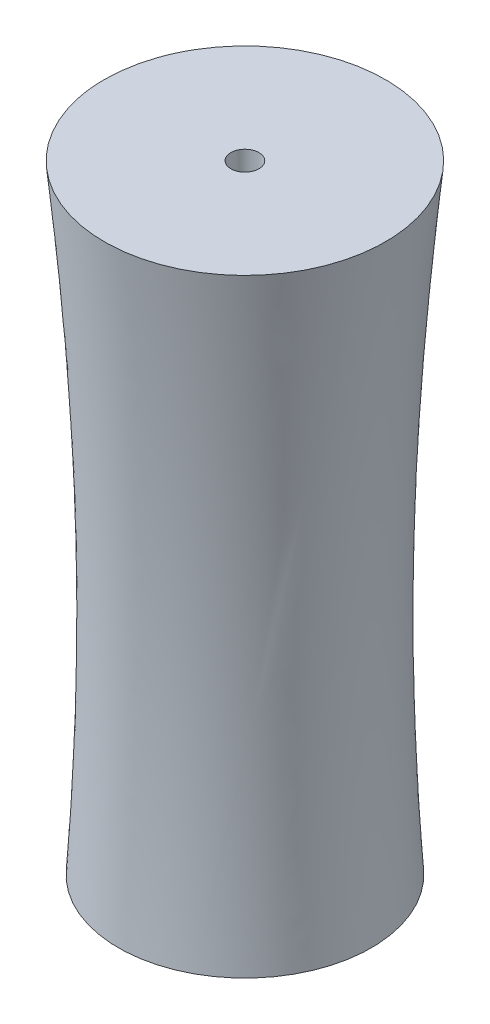
ISO-10303-21;
HEADER;
FILE_DESCRIPTION(('STEP AP214'),'2;1');
FILE_NAME('part.step','',(''),(''),'','','');
FILE_SCHEMA(('AUTOMOTIVE_DESIGN { 1 0 10303 214 1 1 1 1 }'));
ENDSEC;
DATA;
#1=APPLICATION_CONTEXT('core data for automotive mechanical design processes');
#2=APPLICATION_PROTOCOL_DEFINITION('international standard','automotive_design',2000,#1);
#3=PRODUCT_CONTEXT('',#1,'mechanical');
#4=PRODUCT('Part','Part','',(#3));
#5=PRODUCT_RELATED_PRODUCT_CATEGORY('part','',(#4));
#6=PRODUCT_DEFINITION_FORMATION('','',#4);
#7=PRODUCT_DEFINITION_CONTEXT('part definition',#1,'design');
#8=PRODUCT_DEFINITION('design','',#6,#7);
#9=PRODUCT_DEFINITION_SHAPE('','',#8);
#10=(LENGTH_UNIT() NAMED_UNIT(*) SI_UNIT(.MILLI.,.METRE.));
#11=(NAMED_UNIT(*) PLANE_ANGLE_UNIT() SI_UNIT($,.RADIAN.));
#12=(NAMED_UNIT(*) SI_UNIT($,.STERADIAN.) SOLID_ANGLE_UNIT());
#13=UNCERTAINTY_MEASURE_WITH_UNIT(LENGTH_MEASURE(1.E-05),#10,'distance_accuracy_value','');
#14=(GEOMETRIC_REPRESENTATION_CONTEXT(3) GLOBAL_UNCERTAINTY_ASSIGNED_CONTEXT((#13)) GLOBAL_UNIT_ASSIGNED_CONTEXT((#10,
#11,#12)) REPRESENTATION_CONTEXT('',''));
#15=CARTESIAN_POINT('',(0.,0.,0.));
#16=DIRECTION('',(0.,0.,1.));
#17=DIRECTION('',(1.,0.,0.));
#18=AXIS2_PLACEMENT_3D('',#15,#16,#17);
#19=CARTESIAN_POINT('',(0.,-22.0001,0.));
#20=DIRECTION('',(0.,1.,0.));
#21=DIRECTION('',(0.,0.,1.));
#22=AXIS2_PLACEMENT_3D('',#19,#20,#21);
#23=CYLINDRICAL_SURFACE('',#22,0.5);
#24=CARTESIAN_POINT('',(0.,0.,0.));
#25=DIRECTION('',(0.,1.,0.));
#26=DIRECTION('',(0.,0.,1.));
#27=AXIS2_PLACEMENT_3D('',#24,#25,#26);
#28=CIRCLE('',#27,0.5);
#29=CARTESIAN_POINT('',(0.,0.,0.5));
#30=VERTEX_POINT('',#29);
#31=EDGE_CURVE('E49',#30,#30,#28,.T.);
#32=ORIENTED_EDGE('',*,*,#31,.T.);
#33=EDGE_LOOP('',(#32));
#34=FACE_BOUND('',#33,.T.);
#35=CARTESIAN_POINT('',(0.,-20.,0.));
#36=DIRECTION('',(0.,-1.,0.));
#37=DIRECTION('',(0.,0.,-1.));
#38=AXIS2_PLACEMENT_3D('',#35,#36,#37);
#39=CIRCLE('',#38,0.5);
#40=CARTESIAN_POINT('',(0.,-20.,-0.5));
#41=VERTEX_POINT('',#40);
#42=EDGE_CURVE('E39',#41,#41,#39,.F.);
#43=ORIENTED_EDGE('',*,*,#42,.F.);
#44=EDGE_LOOP('',(#43));
#45=FACE_BOUND('',#44,.T.);
#46=ADVANCED_FACE('F34',(#34,#45),#23,.F.);
#47=CARTESIAN_POINT('',(0.,-22.,0.));
#48=DIRECTION('',(0.,1.,0.));
#49=DIRECTION('',(0.,0.,1.));
#50=AXIS2_PLACEMENT_3D('',#47,#48,#49);
#51=PLANE('',#50);
#52=CARTESIAN_POINT('',(0.,-22.,0.));
#53=DIRECTION('',(0.,-1.,0.));
#54=DIRECTION('',(0.,0.,-1.));
#55=AXIS2_PLACEMENT_3D('',#52,#53,#54);
#56=CIRCLE('',#55,2.5);
#57=CARTESIAN_POINT('',(0.,-22.,-2.5));
#58=VERTEX_POINT('',#57);
#59=EDGE_CURVE('E114',#58,#58,#56,.T.);
#60=ORIENTED_EDGE('',*,*,#59,.F.);
#61=EDGE_LOOP('',(#60));
#62=FACE_BOUND('',#61,.T.);
#63=CARTESIAN_POINT('',(0.,-22.,0.));
#64=DIRECTION('',(0.,1.,0.));
#65=DIRECTION('',(0.,0.,1.));
#66=AXIS2_PLACEMENT_3D('',#63,#64,#65);
#67=CIRCLE('',#66,4.5);
#68=CARTESIAN_POINT('',(2.15599757808678,-22.,3.94989549776749));
#69=VERTEX_POINT('',#68);
#70=EDGE_CURVE('E11',#69,#69,#67,.T.);
#71=ORIENTED_EDGE('',*,*,#70,.F.);
#72=EDGE_LOOP('',(#71));
#73=FACE_BOUND('',#72,.T.);
#74=ADVANCED_FACE('F36',(#62,#73),#51,.F.);
#75=CARTESIAN_POINT('',(0.,0.,0.));
#76=DIRECTION('',(0.,1.,0.));
#77=DIRECTION('',(0.,0.,1.));
#78=AXIS2_PLACEMENT_3D('',#75,#76,#77);
#79=PLANE('',#78);
#80=ORIENTED_EDGE('',*,*,#31,.F.);
#81=EDGE_LOOP('',(#80));
#82=FACE_BOUND('',#81,.T.);
#83=CARTESIAN_POINT('',(0.,0.,0.));
#84=DIRECTION('',(0.,1.,0.));
#85=DIRECTION('',(0.,0.,1.));
#86=AXIS2_PLACEMENT_3D('',#83,#84,#85);
#87=CIRCLE('',#86,5.);
#88=CARTESIAN_POINT('',(4.93479628606008,0.,0.804851299985032));
#89=VERTEX_POINT('',#88);
#90=EDGE_CURVE('E43',#89,#89,#87,.T.);
#91=ORIENTED_EDGE('',*,*,#90,.T.);
#92=EDGE_LOOP('',(#91));
#93=FACE_BOUND('',#92,.T.);
#94=ADVANCED_FACE('F70',(#82,#93),#79,.T.);
#95=CARTESIAN_POINT('',(4.93479628606008,0.,0.804851299985032));
#96=CARTESIAN_POINT('',(2.15599757808678,-22.,3.94989549776749));
#97=CARTESIAN_POINT('',(3.32509368609002,0.,10.6744438721052));
#98=CARTESIAN_POINT('',(-5.74379341744821,-22.,8.26189065394106));
#99=CARTESIAN_POINT('',(-6.54449888603015,0.,9.06474127213513));
#100=CARTESIAN_POINT('',(-10.0557885736218,-22.,0.362099658406065));
#101=CARTESIAN_POINT('',(-4.93479628606008,0.,-0.804851299985033));
#102=CARTESIAN_POINT('',(-2.15599757808678,-22.,-3.9498954977675));
#103=CARTESIAN_POINT('',(-3.32509368609002,0.,-10.6744438721052));
#104=CARTESIAN_POINT('',(5.74379341744821,-22.,-8.26189065394106));
#105=CARTESIAN_POINT('',(6.54449888603015,0.,-9.06474127213513));
#106=CARTESIAN_POINT('',(10.0557885736218,-22.,-0.362099658406067));
#107=CARTESIAN_POINT('',(4.93479628606008,0.,0.804851299985032));
#108=CARTESIAN_POINT('',(2.15599757808678,-22.,3.94989549776749));
#109=(BOUNDED_SURFACE() B_SPLINE_SURFACE(3,1,((#95,#96),(#97,#98),(#99,#100),(#101,#102),(#103,
#104),(#105,#106),(#107,#108)),.UNSPECIFIED.,.T.,.F.,.F.) B_SPLINE_SURFACE_WITH_KNOTS((4,3,4),
(2,2),(0.,0.5,1.),(0.,1.),
.UNSPECIFIED.) GEOMETRIC_REPRESENTATION_ITEM() RATIONAL_B_SPLINE_SURFACE(((1.,1.),
(0.333333333333333,0.333333333333333),(0.333333333333333,0.333333333333333),(1.,1.),
(0.333333333333333,0.333333333333333),(0.333333333333333,0.333333333333333),(1.,1.))) REPRESENTATION_ITEM('') SURFACE());
#110=CARTESIAN_POINT('',(4.93479628606008,0.,0.804851299985032));
#111=CARTESIAN_POINT('',(4.90585046618536,-0.229166666666666,0.837612177045266));
#112=CARTESIAN_POINT('',(4.87690464631064,-0.458333333333333,0.8703730541055));
#113=CARTESIAN_POINT('',(4.8190130065612,-0.916666666666667,0.935894808225968));
#114=CARTESIAN_POINT('',(4.79006718668647,-1.14583333333333,0.968655685286202));
#115=CARTESIAN_POINT('',(4.73217554693703,-1.60416666666667,1.03417743940667));
#116=CARTESIAN_POINT('',(4.70322972706231,-1.83333333333333,1.0669383164669));
#117=CARTESIAN_POINT('',(4.64533808731286,-2.29166666666667,1.13246007058737));
#118=CARTESIAN_POINT('',(4.61639226743814,-2.52083333333333,1.16522094764761));
#119=CARTESIAN_POINT('',(4.5585006276887,-2.97916666666667,1.23074270176807));
#120=CARTESIAN_POINT('',(4.52955480781398,-3.20833333333333,1.26350357882831));
#121=CARTESIAN_POINT('',(4.47166316806453,-3.66666666666667,1.32902533294878));
#122=CARTESIAN_POINT('',(4.44271734818981,-3.89583333333333,1.36178621000901));
#123=CARTESIAN_POINT('',(4.38482570844037,-4.35416666666667,1.42730796412948));
#124=CARTESIAN_POINT('',(4.35587988856564,-4.58333333333333,1.46006884118971));
#125=CARTESIAN_POINT('',(4.2979882488162,-5.04166666666667,1.52559059531018));
#126=CARTESIAN_POINT('',(4.26904242894148,-5.27083333333333,1.55835147237041));
#127=CARTESIAN_POINT('',(4.21115078919204,-5.72916666666667,1.62387322649088));
#128=CARTESIAN_POINT('',(4.18220496931731,-5.95833333333333,1.65663410355112));
#129=CARTESIAN_POINT('',(4.12431332956787,-6.41666666666667,1.72215585767158));
#130=CARTESIAN_POINT('',(4.09536750969315,-6.64583333333333,1.75491673473182));
#131=CARTESIAN_POINT('',(4.0374758699437,-7.10416666666667,1.82043848885229));
#132=CARTESIAN_POINT('',(4.00853005006898,-7.33333333333333,1.85319936591252));
#133=CARTESIAN_POINT('',(3.95063841031954,-7.79166666666667,1.91872112003299));
#134=CARTESIAN_POINT('',(3.92169259044482,-8.02083333333333,1.95148199709322));
#135=CARTESIAN_POINT('',(3.86380095069537,-8.47916666666667,2.01700375121369));
#136=CARTESIAN_POINT('',(3.83485513082065,-8.70833333333333,2.04976462827392));
#137=CARTESIAN_POINT('',(3.77696349107121,-9.16666666666667,2.11528638239439));
#138=CARTESIAN_POINT('',(3.74801767119649,-9.39583333333333,2.14804725945463));
#139=CARTESIAN_POINT('',(3.69012603144704,-9.85416666666667,2.21356901357509));
#140=CARTESIAN_POINT('',(3.66118021157232,-10.0833333333333,2.24632989063533));
#141=CARTESIAN_POINT('',(3.60328857182288,-10.5416666666667,2.3118516447558));
#142=CARTESIAN_POINT('',(3.57434275194815,-10.7708333333333,2.34461252181603));
#143=CARTESIAN_POINT('',(3.51645111219871,-11.2291666666667,2.4101342759365));
#144=CARTESIAN_POINT('',(3.48750529232399,-11.4583333333333,2.44289515299673));
#145=CARTESIAN_POINT('',(3.42961365257454,-11.9166666666667,2.5084169071172));
#146=CARTESIAN_POINT('',(3.40066783269982,-12.1458333333333,2.54117778417743));
#147=CARTESIAN_POINT('',(3.34277619295038,-12.6041666666667,2.6066995382979));
#148=CARTESIAN_POINT('',(3.31383037307566,-12.8333333333333,2.63946041535814));
#149=CARTESIAN_POINT('',(3.25593873332621,-13.2916666666667,2.7049821694786));
#150=CARTESIAN_POINT('',(3.22699291345149,-13.5208333333333,2.73774304653884));
#151=CARTESIAN_POINT('',(3.16910127370205,-13.9791666666667,2.80326480065931));
#152=CARTESIAN_POINT('',(3.14015545382733,-14.2083333333333,2.83602567771954));
#153=CARTESIAN_POINT('',(3.08226381407788,-14.6666666666667,2.90154743184001));
#154=CARTESIAN_POINT('',(3.05331799420316,-14.8958333333333,2.93430830890024));
#155=CARTESIAN_POINT('',(2.99542635445372,-15.3541666666667,2.99983006302071));
#156=CARTESIAN_POINT('',(2.96648053457899,-15.5833333333333,3.03259094008094));
#157=CARTESIAN_POINT('',(2.90858889482955,-16.0416666666667,3.09811269420141));
#158=CARTESIAN_POINT('',(2.87964307495483,-16.2708333333333,3.13087357126164));
#159=CARTESIAN_POINT('',(2.82175143520538,-16.7291666666667,3.19639532538211));
#160=CARTESIAN_POINT('',(2.79280561533066,-16.9583333333333,3.22915620244235));
#161=CARTESIAN_POINT('',(2.73491397558122,-17.4166666666667,3.29467795656282));
#162=CARTESIAN_POINT('',(2.7059681557065,-17.6458333333333,3.32743883362305));
#163=CARTESIAN_POINT('',(2.64807651595705,-18.1041666666667,3.39296058774352));
#164=CARTESIAN_POINT('',(2.61913069608233,-18.3333333333333,3.42572146480375));
#165=CARTESIAN_POINT('',(2.56123905633289,-18.7916666666667,3.49124321892422));
#166=CARTESIAN_POINT('',(2.53229323645817,-19.0208333333333,3.52400409598445));
#167=CARTESIAN_POINT('',(2.47440159670872,-19.4791666666667,3.58952585010492));
#168=CARTESIAN_POINT('',(2.445455776834,-19.7083333333333,3.62228672716516));
#169=CARTESIAN_POINT('',(2.38756413708456,-20.1666666666667,3.68780848128562));
#170=CARTESIAN_POINT('',(2.35861831720983,-20.3958333333333,3.72056935834586));
#171=CARTESIAN_POINT('',(2.30072667746039,-20.8541666666667,3.78609111246633));
#172=CARTESIAN_POINT('',(2.27178085758567,-21.0833333333333,3.81885198952656));
#173=CARTESIAN_POINT('',(2.21388921783623,-21.5416666666667,3.88437374364703));
#174=CARTESIAN_POINT('',(2.1849433979615,-21.7708333333333,3.91713462070726));
#175=CARTESIAN_POINT('',(2.15599757808678,-22.,3.94989549776749));
#176=B_SPLINE_CURVE_WITH_KNOTS('',3,(#110,#111,#112,#113,#114,#115,#116,#117,#118,#119,#120,
#121,#122,#123,#124,#125,#126,#127,#128,#129,#130,#131,#132,#133,#134,#135,#136,#137,#138,#139,
#140,#141,#142,#143,#144,#145,#146,#147,#148,#149,#150,#151,#152,#153,#154,#155,#156,#157,#158,
#159,#160,#161,#162,#163,#164,#165,#166,#167,#168,#169,#170,#171,#172,#173,#174,#175),
.UNSPECIFIED.,.F.,.F.,(4,2,2,2,2,2,2,2,2,2,2,2,2,2,2,2,2,2,2,2,2,2,2,2,2,2,2,2,2,2,2,2,4),(0.,
0.699897471052568,1.39979494210514,2.0996924131577,2.79958988421027,3.49948735526284,
4.19938482631541,4.89928229736798,5.59917976842055,6.29907723947311,6.99897471052568,
7.69887218157825,8.39876965263082,9.09866712368339,9.79856459473595,10.4984620657885,
11.1983595368411,11.8982570078937,12.5981544789462,13.2980519499988,13.9979494210514,
14.6978468921039,15.3977443631565,16.0976418342091,16.7975393052616,17.4974367763142,
18.1973342473668,18.8972317184193,19.5971291894719,20.2970266605245,20.996924131577,
21.6968216026296,22.3967190736822),.UNSPECIFIED.);
#177=EDGE_CURVE('BSEAM79',#89,#69,#176,.T.);
#178=ORIENTED_EDGE('',*,*,#90,.F.);
#179=ORIENTED_EDGE('',*,*,#70,.T.);
#180=ORIENTED_EDGE('',*,*,#177,.T.);
#181=ORIENTED_EDGE('',*,*,#177,.F.);
#182=EDGE_LOOP('',(#178,#180,#179,#181));
#183=FACE_BOUND('',#182,.T.);
#184=ADVANCED_FACE('F79',(#183),#109,.T.);
#185=CARTESIAN_POINT('',(0.,-20.,0.));
#186=DIRECTION('',(0.,-1.,0.));
#187=DIRECTION('',(0.,0.,-1.));
#188=AXIS2_PLACEMENT_3D('',#185,#186,#187);
#189=PLANE('',#188);
#190=CARTESIAN_POINT('',(0.,-20.,0.));
#191=DIRECTION('',(0.,-1.,0.));
#192=DIRECTION('',(0.,0.,-1.));
#193=AXIS2_PLACEMENT_3D('',#190,#191,#192);
#194=CIRCLE('',#193,2.5);
#195=CARTESIAN_POINT('',(0.,-20.,-2.5));
#196=VERTEX_POINT('',#195);
#197=EDGE_CURVE('E117',#196,#196,#194,.T.);
#198=ORIENTED_EDGE('',*,*,#197,.T.);
#199=EDGE_LOOP('',(#198));
#200=FACE_BOUND('',#199,.T.);
#201=ORIENTED_EDGE('',*,*,#42,.T.);
#202=EDGE_LOOP('',(#201));
#203=FACE_BOUND('',#202,.T.);
#204=ADVANCED_FACE('F86',(#200,#203),#189,.T.);
#205=CARTESIAN_POINT('',(0.,-20.,0.));
#206=DIRECTION('',(0.,-1.,0.));
#207=DIRECTION('',(0.,0.,-1.));
#208=AXIS2_PLACEMENT_3D('',#205,#206,#207);
#209=CYLINDRICAL_SURFACE('',#208,2.5);
#210=ORIENTED_EDGE('',*,*,#197,.F.);
#211=EDGE_LOOP('',(#210));
#212=FACE_BOUND('',#211,.T.);
#213=ORIENTED_EDGE('',*,*,#59,.T.);
#214=EDGE_LOOP('',(#213));
#215=FACE_BOUND('',#214,.T.);
#216=ADVANCED_FACE('F137',(#212,#215),#209,.F.);
#217=CLOSED_SHELL('',(#46,#74,#94,#184,#204,#216));
#218=MANIFOLD_SOLID_BREP('B2',#217);
#219=ADVANCED_BREP_SHAPE_REPRESENTATION('',(#18,#218),#14);
#220=SHAPE_DEFINITION_REPRESENTATION(#9,#219);
ENDSEC;
END-ISO-10303-21;
